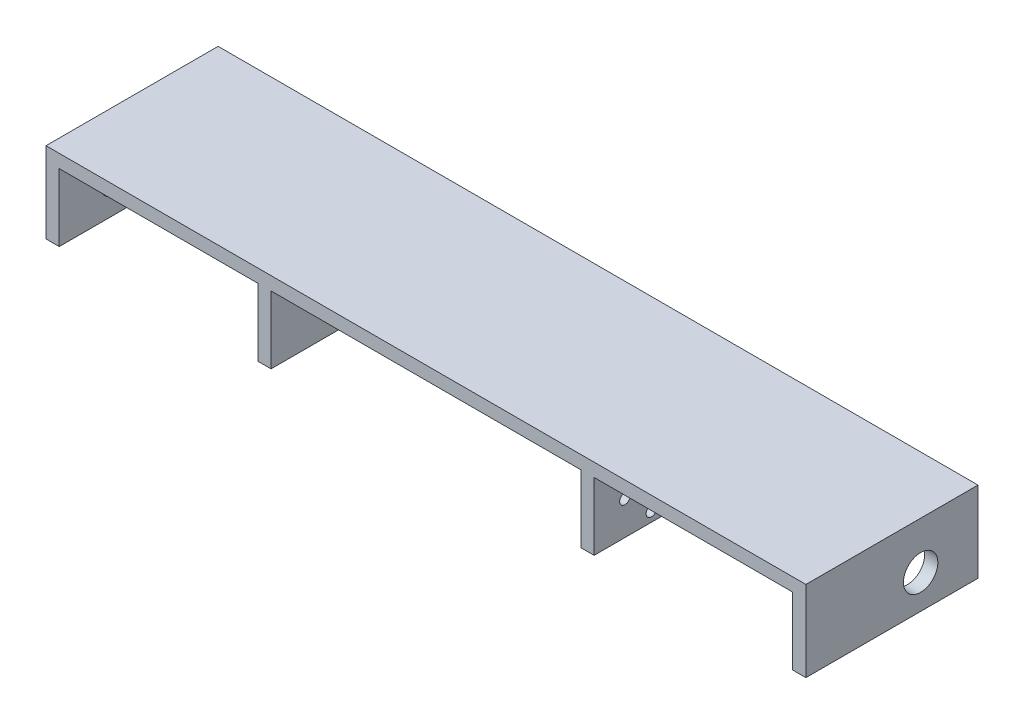
ISO-10303-21;
HEADER;
FILE_DESCRIPTION(('STEP AP214'),'2;1');
FILE_NAME('part.step','',(''),(''),'','','');
FILE_SCHEMA(('AUTOMOTIVE_DESIGN { 1 0 10303 214 1 1 1 1 }'));
ENDSEC;
DATA;
#1=APPLICATION_CONTEXT('core data for automotive mechanical design processes');
#2=APPLICATION_PROTOCOL_DEFINITION('international standard','automotive_design',2000,#1);
#3=PRODUCT_CONTEXT('',#1,'mechanical');
#4=PRODUCT('Part','Part','',(#3));
#5=PRODUCT_RELATED_PRODUCT_CATEGORY('part','',(#4));
#6=PRODUCT_DEFINITION_FORMATION('','',#4);
#7=PRODUCT_DEFINITION_CONTEXT('part definition',#1,'design');
#8=PRODUCT_DEFINITION('design','',#6,#7);
#9=PRODUCT_DEFINITION_SHAPE('','',#8);
#10=(LENGTH_UNIT() NAMED_UNIT(*) SI_UNIT(.MILLI.,.METRE.));
#11=(NAMED_UNIT(*) PLANE_ANGLE_UNIT() SI_UNIT($,.RADIAN.));
#12=(NAMED_UNIT(*) SI_UNIT($,.STERADIAN.) SOLID_ANGLE_UNIT());
#13=UNCERTAINTY_MEASURE_WITH_UNIT(LENGTH_MEASURE(1.E-05),#10,'distance_accuracy_value','');
#14=(GEOMETRIC_REPRESENTATION_CONTEXT(3) GLOBAL_UNCERTAINTY_ASSIGNED_CONTEXT((#13)) GLOBAL_UNIT_ASSIGNED_CONTEXT((#10,
#11,#12)) REPRESENTATION_CONTEXT('',''));
#15=CARTESIAN_POINT('',(0.,0.,0.));
#16=DIRECTION('',(0.,0.,1.));
#17=DIRECTION('',(1.,0.,0.));
#18=AXIS2_PLACEMENT_3D('',#15,#16,#17);
#19=CARTESIAN_POINT('',(0.,0.,0.));
#20=DIRECTION('',(0.,1.,0.));
#21=DIRECTION('',(0.,0.,1.));
#22=AXIS2_PLACEMENT_3D('',#19,#20,#21);
#23=PLANE('',#22);
#24=DIRECTION('',(1.,0.,0.));
#25=VECTOR('',#24,1.);
#26=CARTESIAN_POINT('',(158.32728197391,0.,-46.9681348074232));
#27=LINE('',#26,#25);
#28=CARTESIAN_POINT('',(158.32728197391,0.,-46.9681348074232));
#29=VERTEX_POINT('',#28);
#30=CARTESIAN_POINT('',(159.32728197391,0.,-46.9681348074232));
#31=VERTEX_POINT('',#30);
#32=EDGE_CURVE('E208',#29,#31,#27,.T.);
#33=ORIENTED_EDGE('',*,*,#32,.F.);
#34=DIRECTION('',(0.,0.,-1.));
#35=VECTOR('',#34,1.);
#36=CARTESIAN_POINT('',(158.32728197391,0.,-46.9681348074232));
#37=LINE('',#36,#35);
#38=CARTESIAN_POINT('',(158.32728197391,0.,-45.9681348074232));
#39=VERTEX_POINT('',#38);
#40=EDGE_CURVE('E215',#39,#29,#37,.T.);
#41=ORIENTED_EDGE('',*,*,#40,.F.);
#42=DIRECTION('',(1.,0.,0.));
#43=VECTOR('',#42,1.);
#44=CARTESIAN_POINT('',(158.32728197391,0.,-45.9681348074232));
#45=LINE('',#44,#43);
#46=CARTESIAN_POINT('',(159.32728197391,0.,-45.9681348074232));
#47=VERTEX_POINT('',#46);
#48=EDGE_CURVE('E216',#39,#47,#45,.T.);
#49=ORIENTED_EDGE('',*,*,#48,.T.);
#50=DIRECTION('',(0.,0.,-1.));
#51=VECTOR('',#50,1.);
#52=CARTESIAN_POINT('',(159.32728197391,0.,-74.2981348074232));
#53=LINE('',#52,#51);
#54=CARTESIAN_POINT('',(159.32728197391,0.,-15.9681348074232));
#55=VERTEX_POINT('',#54);
#56=EDGE_CURVE('E230',#55,#47,#53,.T.);
#57=ORIENTED_EDGE('',*,*,#56,.F.);
#58=DIRECTION('',(1.,0.,0.));
#59=VECTOR('',#58,1.);
#60=CARTESIAN_POINT('',(158.32728197391,0.,-15.9681348074232));
#61=LINE('',#60,#59);
#62=CARTESIAN_POINT('',(158.32728197391,0.,-15.9681348074232));
#63=VERTEX_POINT('',#62);
#64=EDGE_CURVE('E555',#63,#55,#61,.T.);
#65=ORIENTED_EDGE('',*,*,#64,.F.);
#66=DIRECTION('',(0.,0.,-1.));
#67=VECTOR('',#66,1.);
#68=CARTESIAN_POINT('',(158.32728197391,0.,-15.9681348074232));
#69=LINE('',#68,#67);
#70=CARTESIAN_POINT('',(158.32728197391,0.,-14.9681348074232));
#71=VERTEX_POINT('',#70);
#72=EDGE_CURVE('E553',#71,#63,#69,.T.);
#73=ORIENTED_EDGE('',*,*,#72,.F.);
#74=DIRECTION('',(1.,0.,0.));
#75=VECTOR('',#74,1.);
#76=CARTESIAN_POINT('',(158.32728197391,0.,-14.9681348074232));
#77=LINE('',#76,#75);
#78=CARTESIAN_POINT('',(159.32728197391,0.,-14.9681348074232));
#79=VERTEX_POINT('',#78);
#80=EDGE_CURVE('E559',#71,#79,#77,.T.);
#81=ORIENTED_EDGE('',*,*,#80,.T.);
#82=CARTESIAN_POINT('',(159.32728197391,0.,-9.29813480742324));
#83=VERTEX_POINT('',#82);
#84=EDGE_CURVE('E233',#83,#79,#53,.T.);
#85=ORIENTED_EDGE('',*,*,#84,.F.);
#86=DIRECTION('',(1.,0.,0.));
#87=VECTOR('',#86,1.);
#88=CARTESIAN_POINT('',(-42.6727180260896,0.,-9.29813480742324));
#89=LINE('',#88,#87);
#90=CARTESIAN_POINT('',(42.3272819739104,0.,-9.29813480742324));
#91=VERTEX_POINT('',#90);
#92=EDGE_CURVE('E349',#91,#83,#89,.T.);
#93=ORIENTED_EDGE('',*,*,#92,.F.);
#94=DIRECTION('',(0.,0.,-1.));
#95=VECTOR('',#94,1.);
#96=CARTESIAN_POINT('',(42.3272819739104,0.,-9.29813480742324));
#97=LINE('',#96,#95);
#98=CARTESIAN_POINT('',(42.3272819739104,0.,-74.2981348074232));
#99=VERTEX_POINT('',#98);
#100=EDGE_CURVE('E294',#91,#99,#97,.T.);
#101=ORIENTED_EDGE('',*,*,#100,.T.);
#102=DIRECTION('',(-1.,0.,0.));
#103=VECTOR('',#102,1.);
#104=CARTESIAN_POINT('',(-42.6727180260896,0.,-74.2981348074232));
#105=LINE('',#104,#103);
#106=CARTESIAN_POINT('',(159.32728197391,0.,-74.2981348074232));
#107=VERTEX_POINT('',#106);
#108=EDGE_CURVE('E229',#107,#99,#105,.T.);
#109=ORIENTED_EDGE('',*,*,#108,.F.);
#110=EDGE_CURVE('E222',#31,#107,#53,.T.);
#111=ORIENTED_EDGE('',*,*,#110,.F.);
#112=EDGE_LOOP('',(#33,#41,#49,#57,#65,#73,#81,#85,#93,#101,#109,#111));
#113=FACE_BOUND('',#112,.T.);
#114=ADVANCED_FACE('F47',(#113),#23,.F.);
#115=CARTESIAN_POINT('',(159.32728197391,-25.5,-74.2981348074232));
#116=DIRECTION('',(1.,0.,0.));
#117=DIRECTION('',(0.,0.,-1.));
#118=AXIS2_PLACEMENT_3D('',#115,#116,#117);
#119=PLANE('',#118);
#120=CARTESIAN_POINT('',(159.32728197391,-12.75,-52.6314681407566));
#121=DIRECTION('',(1.,0.,0.));
#122=DIRECTION('',(0.,0.,-1.));
#123=AXIS2_PLACEMENT_3D('',#120,#121,#122);
#124=CIRCLE('',#123,4.5);
#125=CARTESIAN_POINT('',(159.32728197391,-12.75,-57.1314681407566));
#126=VERTEX_POINT('',#125);
#127=EDGE_CURVE('E572',#126,#126,#124,.F.);
#128=ORIENTED_EDGE('',*,*,#127,.F.);
#129=EDGE_LOOP('',(#128));
#130=FACE_BOUND('',#129,.T.);
#131=DIRECTION('',(0.,-1.,0.));
#132=VECTOR('',#131,1.);
#133=CARTESIAN_POINT('',(159.32728197391,-25.5,-46.9681348074232));
#134=LINE('',#133,#132);
#135=CARTESIAN_POINT('',(159.32728197391,-25.5,-46.9681348074232));
#136=VERTEX_POINT('',#135);
#137=EDGE_CURVE('E62',#31,#136,#134,.T.);
#138=ORIENTED_EDGE('',*,*,#137,.F.);
#139=ORIENTED_EDGE('',*,*,#110,.T.);
#140=DIRECTION('',(0.,1.,0.));
#141=VECTOR('',#140,1.);
#142=CARTESIAN_POINT('',(159.32728197391,-25.5,-74.2981348074232));
#143=LINE('',#142,#141);
#144=CARTESIAN_POINT('',(159.32728197391,-25.5,-74.2981348074232));
#145=VERTEX_POINT('',#144);
#146=EDGE_CURVE('E262',#145,#107,#143,.T.);
#147=ORIENTED_EDGE('',*,*,#146,.F.);
#148=DIRECTION('',(0.,0.,-1.));
#149=VECTOR('',#148,1.);
#150=CARTESIAN_POINT('',(159.32728197391,-25.5,-74.2981348074232));
#151=LINE('',#150,#149);
#152=EDGE_CURVE('E224',#136,#145,#151,.T.);
#153=ORIENTED_EDGE('',*,*,#152,.F.);
#154=EDGE_LOOP('',(#138,#139,#147,#153));
#155=FACE_BOUND('',#154,.T.);
#156=ADVANCED_FACE('F220',(#130,#155),#119,.F.);
#157=CARTESIAN_POINT('',(159.32728197391,-12.75,-20.9681348074232));
#158=DIRECTION('',(-1.,0.,0.));
#159=DIRECTION('',(0.,0.,1.));
#160=AXIS2_PLACEMENT_3D('',#157,#158,#159);
#161=CIRCLE('',#160,2.);
#162=CARTESIAN_POINT('',(159.32728197391,-12.75,-18.9681348074232));
#163=VERTEX_POINT('',#162);
#164=EDGE_CURVE('E508',#163,#163,#161,.T.);
#165=ORIENTED_EDGE('',*,*,#164,.F.);
#166=EDGE_LOOP('',(#165));
#167=FACE_BOUND('',#166,.T.);
#168=CARTESIAN_POINT('',(159.32728197391,-12.75,-40.9681348074232));
#169=DIRECTION('',(-1.,0.,0.));
#170=DIRECTION('',(0.,0.,1.));
#171=AXIS2_PLACEMENT_3D('',#168,#169,#170);
#172=CIRCLE('',#171,2.);
#173=CARTESIAN_POINT('',(159.32728197391,-12.75,-38.9681348074232));
#174=VERTEX_POINT('',#173);
#175=EDGE_CURVE('E516',#174,#174,#172,.T.);
#176=ORIENTED_EDGE('',*,*,#175,.F.);
#177=EDGE_LOOP('',(#176));
#178=FACE_BOUND('',#177,.T.);
#179=CARTESIAN_POINT('',(159.32728197391,-21.75,-30.9681348074232));
#180=DIRECTION('',(-1.,0.,0.));
#181=DIRECTION('',(0.,0.,1.));
#182=AXIS2_PLACEMENT_3D('',#179,#180,#181);
#183=CIRCLE('',#182,2.);
#184=CARTESIAN_POINT('',(159.32728197391,-21.75,-28.9681348074232));
#185=VERTEX_POINT('',#184);
#186=EDGE_CURVE('E522',#185,#185,#183,.T.);
#187=ORIENTED_EDGE('',*,*,#186,.F.);
#188=EDGE_LOOP('',(#187));
#189=FACE_BOUND('',#188,.T.);
#190=CARTESIAN_POINT('',(159.32728197391,-3.75,-30.9681348074232));
#191=DIRECTION('',(-1.,0.,0.));
#192=DIRECTION('',(0.,0.,1.));
#193=AXIS2_PLACEMENT_3D('',#190,#191,#192);
#194=CIRCLE('',#193,2.);
#195=CARTESIAN_POINT('',(159.32728197391,-3.75,-28.9681348074232));
#196=VERTEX_POINT('',#195);
#197=EDGE_CURVE('E528',#196,#196,#194,.T.);
#198=ORIENTED_EDGE('',*,*,#197,.F.);
#199=EDGE_LOOP('',(#198));
#200=FACE_BOUND('',#199,.T.);
#201=DIRECTION('',(0.,1.,0.));
#202=VECTOR('',#201,1.);
#203=CARTESIAN_POINT('',(159.32728197391,-25.5,-45.9681348074232));
#204=LINE('',#203,#202);
#205=CARTESIAN_POINT('',(159.32728197391,-25.5,-45.9681348074232));
#206=VERTEX_POINT('',#205);
#207=EDGE_CURVE('E225',#206,#47,#204,.T.);
#208=ORIENTED_EDGE('',*,*,#207,.F.);
#209=CARTESIAN_POINT('',(159.32728197391,-25.5,-15.9681348074232));
#210=VERTEX_POINT('',#209);
#211=EDGE_CURVE('E258',#210,#206,#151,.T.);
#212=ORIENTED_EDGE('',*,*,#211,.F.);
#213=DIRECTION('',(0.,-1.,0.));
#214=VECTOR('',#213,1.);
#215=CARTESIAN_POINT('',(159.32728197391,-25.5,-15.9681348074232));
#216=LINE('',#215,#214);
#217=EDGE_CURVE('E70',#55,#210,#216,.T.);
#218=ORIENTED_EDGE('',*,*,#217,.F.);
#219=ORIENTED_EDGE('',*,*,#56,.T.);
#220=EDGE_LOOP('',(#208,#212,#218,#219));
#221=FACE_BOUND('',#220,.T.);
#222=ADVANCED_FACE('F439',(#167,#178,#189,#200,#221),#119,.F.);
#223=DIRECTION('',(0.,1.,0.));
#224=VECTOR('',#223,1.);
#225=CARTESIAN_POINT('',(159.32728197391,-25.5,-14.9681348074232));
#226=LINE('',#225,#224);
#227=CARTESIAN_POINT('',(159.32728197391,-25.5,-14.9681348074232));
#228=VERTEX_POINT('',#227);
#229=EDGE_CURVE('E549',#228,#79,#226,.T.);
#230=ORIENTED_EDGE('',*,*,#229,.F.);
#231=CARTESIAN_POINT('',(159.32728197391,-25.5,-9.29813480742324));
#232=VERTEX_POINT('',#231);
#233=EDGE_CURVE('E254',#232,#228,#151,.T.);
#234=ORIENTED_EDGE('',*,*,#233,.F.);
#235=DIRECTION('',(0.,1.,0.));
#236=VECTOR('',#235,1.);
#237=CARTESIAN_POINT('',(159.32728197391,-25.5,-9.29813480742324));
#238=LINE('',#237,#236);
#239=EDGE_CURVE('E265',#232,#83,#238,.T.);
#240=ORIENTED_EDGE('',*,*,#239,.T.);
#241=ORIENTED_EDGE('',*,*,#84,.T.);
#242=EDGE_LOOP('',(#230,#234,#240,#241));
#243=FACE_BOUND('',#242,.T.);
#244=ADVANCED_FACE('F441',(#243),#119,.F.);
#245=DIRECTION('',(0.,0.,1.));
#246=VECTOR('',#245,1.);
#247=CARTESIAN_POINT('',(164.32728197391,0.,-74.2981348074232));
#248=LINE('',#247,#246);
#249=CARTESIAN_POINT('',(164.32728197391,0.,-74.2981348074232));
#250=VERTEX_POINT('',#249);
#251=CARTESIAN_POINT('',(164.32728197391,0.,-9.29813480742324));
#252=VERTEX_POINT('',#251);
#253=EDGE_CURVE('E231',#250,#252,#248,.T.);
#254=ORIENTED_EDGE('',*,*,#253,.F.);
#255=CARTESIAN_POINT('',(239.32728197391,0.,-74.2981348074232));
#256=VERTEX_POINT('',#255);
#257=EDGE_CURVE('E338',#256,#250,#105,.T.);
#258=ORIENTED_EDGE('',*,*,#257,.F.);
#259=DIRECTION('',(0.,0.,-1.));
#260=VECTOR('',#259,1.);
#261=CARTESIAN_POINT('',(239.32728197391,0.,-9.29813480742324));
#262=LINE('',#261,#260);
#263=CARTESIAN_POINT('',(239.32728197391,0.,-9.29813480742324));
#264=VERTEX_POINT('',#263);
#265=EDGE_CURVE('E271',#264,#256,#262,.T.);
#266=ORIENTED_EDGE('',*,*,#265,.F.);
#267=EDGE_CURVE('E333',#252,#264,#89,.T.);
#268=ORIENTED_EDGE('',*,*,#267,.F.);
#269=EDGE_LOOP('',(#254,#258,#266,#268));
#270=FACE_BOUND('',#269,.T.);
#271=ADVANCED_FACE('F415',(#270),#23,.F.);
#272=DIRECTION('',(0.,0.,-1.));
#273=VECTOR('',#272,1.);
#274=CARTESIAN_POINT('',(37.3272819739104,0.,-9.29813480742324));
#275=LINE('',#274,#273);
#276=CARTESIAN_POINT('',(37.3272819739104,0.,-9.29813480742324));
#277=VERTEX_POINT('',#276);
#278=CARTESIAN_POINT('',(37.3272819739104,0.,-74.2981348074232));
#279=VERTEX_POINT('',#278);
#280=EDGE_CURVE('E289',#277,#279,#275,.T.);
#281=ORIENTED_EDGE('',*,*,#280,.F.);
#282=CARTESIAN_POINT('',(-37.6727180260896,0.,-9.29813480742324));
#283=VERTEX_POINT('',#282);
#284=EDGE_CURVE('E345',#283,#277,#89,.T.);
#285=ORIENTED_EDGE('',*,*,#284,.F.);
#286=DIRECTION('',(0.,0.,1.));
#287=VECTOR('',#286,1.);
#288=CARTESIAN_POINT('',(-37.6727180260896,0.,-74.2981348074232));
#289=LINE('',#288,#287);
#290=CARTESIAN_POINT('',(-37.6727180260896,0.,-74.2981348074232));
#291=VERTEX_POINT('',#290);
#292=EDGE_CURVE('E314',#291,#283,#289,.T.);
#293=ORIENTED_EDGE('',*,*,#292,.F.);
#294=EDGE_CURVE('E348',#279,#291,#105,.T.);
#295=ORIENTED_EDGE('',*,*,#294,.F.);
#296=EDGE_LOOP('',(#281,#285,#293,#295));
#297=FACE_BOUND('',#296,.T.);
#298=ADVANCED_FACE('F394',(#297),#23,.F.);
#299=CARTESIAN_POINT('',(-42.6727180260896,5.,-74.2981348074232));
#300=DIRECTION('',(1.,0.,0.));
#301=DIRECTION('',(0.,0.,-1.));
#302=AXIS2_PLACEMENT_3D('',#299,#300,#301);
#303=PLANE('',#302);
#304=CARTESIAN_POINT('',(-42.6727180260896,-12.75,-30.9648014740899));
#305=DIRECTION('',(-1.,0.,0.));
#306=DIRECTION('',(0.,0.,1.));
#307=AXIS2_PLACEMENT_3D('',#304,#305,#306);
#308=CIRCLE('',#307,6.5);
#309=CARTESIAN_POINT('',(-42.6727180260896,-12.75,-24.4648014740899));
#310=VERTEX_POINT('',#309);
#311=EDGE_CURVE('E583',#310,#310,#308,.T.);
#312=ORIENTED_EDGE('',*,*,#311,.F.);
#313=EDGE_LOOP('',(#312));
#314=FACE_BOUND('',#313,.T.);
#315=DIRECTION('',(0.,-1.,0.));
#316=VECTOR('',#315,1.);
#317=CARTESIAN_POINT('',(-42.6727180260896,5.,-74.2981348074232));
#318=LINE('',#317,#316);
#319=CARTESIAN_POINT('',(-42.6727180260896,5.,-74.2981348074232));
#320=VERTEX_POINT('',#319);
#321=CARTESIAN_POINT('',(-42.6727180260896,-25.5,-74.2981348074232));
#322=VERTEX_POINT('',#321);
#323=EDGE_CURVE('E344',#320,#322,#318,.T.);
#324=ORIENTED_EDGE('',*,*,#323,.T.);
#325=DIRECTION('',(0.,0.,-1.));
#326=VECTOR('',#325,1.);
#327=CARTESIAN_POINT('',(-42.6727180260896,-25.5,-74.2981348074232));
#328=LINE('',#327,#326);
#329=CARTESIAN_POINT('',(-42.6727180260896,-25.5,-9.29813480742324));
#330=VERTEX_POINT('',#329);
#331=EDGE_CURVE('E315',#330,#322,#328,.T.);
#332=ORIENTED_EDGE('',*,*,#331,.F.);
#333=DIRECTION('',(0.,-1.,0.));
#334=VECTOR('',#333,1.);
#335=CARTESIAN_POINT('',(-42.6727180260896,5.,-9.29813480742324));
#336=LINE('',#335,#334);
#337=CARTESIAN_POINT('',(-42.6727180260896,5.,-9.29813480742324));
#338=VERTEX_POINT('',#337);
#339=EDGE_CURVE('E11',#338,#330,#336,.T.);
#340=ORIENTED_EDGE('',*,*,#339,.F.);
#341=DIRECTION('',(0.,0.,1.));
#342=VECTOR('',#341,1.);
#343=CARTESIAN_POINT('',(-42.6727180260896,5.,-74.2981348074232));
#344=LINE('',#343,#342);
#345=EDGE_CURVE('E334',#320,#338,#344,.T.);
#346=ORIENTED_EDGE('',*,*,#345,.F.);
#347=EDGE_LOOP('',(#324,#332,#340,#346));
#348=FACE_BOUND('',#347,.T.);
#349=ADVANCED_FACE('F49',(#314,#348),#303,.F.);
#350=CARTESIAN_POINT('',(-42.6727180260896,5.,-9.29813480742324));
#351=DIRECTION('',(0.,0.,-1.));
#352=DIRECTION('',(-1.,0.,0.));
#353=AXIS2_PLACEMENT_3D('',#350,#351,#352);
#354=PLANE('',#353);
#355=ORIENTED_EDGE('',*,*,#339,.T.);
#356=DIRECTION('',(-1.,0.,0.));
#357=VECTOR('',#356,1.);
#358=CARTESIAN_POINT('',(-42.6727180260896,-25.5,-9.29813480742324));
#359=LINE('',#358,#357);
#360=CARTESIAN_POINT('',(-37.6727180260896,-25.5,-9.29813480742324));
#361=VERTEX_POINT('',#360);
#362=EDGE_CURVE('E322',#361,#330,#359,.T.);
#363=ORIENTED_EDGE('',*,*,#362,.F.);
#364=DIRECTION('',(0.,1.,0.));
#365=VECTOR('',#364,1.);
#366=CARTESIAN_POINT('',(-37.6727180260896,-25.5,-9.29813480742324));
#367=LINE('',#366,#365);
#368=EDGE_CURVE('E325',#361,#283,#367,.T.);
#369=ORIENTED_EDGE('',*,*,#368,.T.);
#370=ORIENTED_EDGE('',*,*,#284,.T.);
#371=DIRECTION('',(0.,1.,0.));
#372=VECTOR('',#371,1.);
#373=CARTESIAN_POINT('',(37.3272819739104,-25.5,-9.29813480742324));
#374=LINE('',#373,#372);
#375=CARTESIAN_POINT('',(37.3272819739104,-25.5,-9.29813480742324));
#376=VERTEX_POINT('',#375);
#377=EDGE_CURVE('E312',#376,#277,#374,.T.);
#378=ORIENTED_EDGE('',*,*,#377,.F.);
#379=DIRECTION('',(-1.,0.,0.));
#380=VECTOR('',#379,1.);
#381=CARTESIAN_POINT('',(42.3272819739104,-25.5,-9.29813480742324));
#382=LINE('',#381,#380);
#383=CARTESIAN_POINT('',(42.3272819739104,-25.5,-9.29813480742324));
#384=VERTEX_POINT('',#383);
#385=EDGE_CURVE('E290',#384,#376,#382,.T.);
#386=ORIENTED_EDGE('',*,*,#385,.F.);
#387=DIRECTION('',(0.,1.,0.));
#388=VECTOR('',#387,1.);
#389=CARTESIAN_POINT('',(42.3272819739104,-25.5,-9.29813480742324));
#390=LINE('',#389,#388);
#391=EDGE_CURVE('E302',#384,#91,#390,.T.);
#392=ORIENTED_EDGE('',*,*,#391,.T.);
#393=ORIENTED_EDGE('',*,*,#92,.T.);
#394=ORIENTED_EDGE('',*,*,#239,.F.);
#395=DIRECTION('',(-1.,0.,0.));
#396=VECTOR('',#395,1.);
#397=CARTESIAN_POINT('',(164.32728197391,-25.5,-9.29813480742324));
#398=LINE('',#397,#396);
#399=CARTESIAN_POINT('',(164.32728197391,-25.5,-9.29813480742324));
#400=VERTEX_POINT('',#399);
#401=EDGE_CURVE('E245',#400,#232,#398,.T.);
#402=ORIENTED_EDGE('',*,*,#401,.F.);
#403=DIRECTION('',(0.,1.,0.));
#404=VECTOR('',#403,1.);
#405=CARTESIAN_POINT('',(164.32728197391,-25.5,-9.29813480742324));
#406=LINE('',#405,#404);
#407=EDGE_CURVE('E269',#400,#252,#406,.T.);
#408=ORIENTED_EDGE('',*,*,#407,.T.);
#409=ORIENTED_EDGE('',*,*,#267,.T.);
#410=DIRECTION('',(0.,1.,0.));
#411=VECTOR('',#410,1.);
#412=CARTESIAN_POINT('',(239.32728197391,-25.5,-9.29813480742324));
#413=LINE('',#412,#411);
#414=CARTESIAN_POINT('',(239.32728197391,-25.5,-9.29813480742324));
#415=VERTEX_POINT('',#414);
#416=EDGE_CURVE('E286',#415,#264,#413,.T.);
#417=ORIENTED_EDGE('',*,*,#416,.F.);
#418=DIRECTION('',(-1.,0.,0.));
#419=VECTOR('',#418,1.);
#420=CARTESIAN_POINT('',(244.32728197391,-25.5,-9.29813480742324));
#421=LINE('',#420,#419);
#422=CARTESIAN_POINT('',(244.32728197391,-25.5,-9.29813480742324));
#423=VERTEX_POINT('',#422);
#424=EDGE_CURVE('E275',#423,#415,#421,.T.);
#425=ORIENTED_EDGE('',*,*,#424,.F.);
#426=DIRECTION('',(0.,-1.,0.));
#427=VECTOR('',#426,1.);
#428=CARTESIAN_POINT('',(244.32728197391,5.,-9.29813480742324));
#429=LINE('',#428,#427);
#430=CARTESIAN_POINT('',(244.32728197391,5.,-9.29813480742324));
#431=VERTEX_POINT('',#430);
#432=EDGE_CURVE('E55',#431,#423,#429,.T.);
#433=ORIENTED_EDGE('',*,*,#432,.F.);
#434=DIRECTION('',(1.,0.,0.));
#435=VECTOR('',#434,1.);
#436=CARTESIAN_POINT('',(-42.6727180260896,5.,-9.29813480742324));
#437=LINE('',#436,#435);
#438=EDGE_CURVE('E337',#338,#431,#437,.T.);
#439=ORIENTED_EDGE('',*,*,#438,.F.);
#440=EDGE_LOOP('',(#355,#363,#369,#370,#378,#386,#392,#393,#394,#402,#408,#409,#417,#425,#433,#439));
#441=FACE_BOUND('',#440,.T.);
#442=ADVANCED_FACE('F363',(#441),#354,.F.);
#443=CARTESIAN_POINT('',(244.32728197391,5.,-74.2981348074232));
#444=DIRECTION('',(-1.,0.,0.));
#445=DIRECTION('',(0.,0.,1.));
#446=AXIS2_PLACEMENT_3D('',#443,#444,#445);
#447=PLANE('',#446);
#448=CARTESIAN_POINT('',(244.32728197391,-12.75,-52.6314681407566));
#449=DIRECTION('',(1.,0.,0.));
#450=DIRECTION('',(0.,0.,-1.));
#451=AXIS2_PLACEMENT_3D('',#448,#449,#450);
#452=CIRCLE('',#451,6.5);
#453=CARTESIAN_POINT('',(244.32728197391,-12.75,-59.1314681407566));
#454=VERTEX_POINT('',#453);
#455=EDGE_CURVE('E581',#454,#454,#452,.T.);
#456=ORIENTED_EDGE('',*,*,#455,.F.);
#457=EDGE_LOOP('',(#456));
#458=FACE_BOUND('',#457,.T.);
#459=ORIENTED_EDGE('',*,*,#432,.T.);
#460=DIRECTION('',(0.,0.,1.));
#461=VECTOR('',#460,1.);
#462=CARTESIAN_POINT('',(244.32728197391,-25.5,-9.29813480742324));
#463=LINE('',#462,#461);
#464=CARTESIAN_POINT('',(244.32728197391,-25.5,-74.2981348074232));
#465=VERTEX_POINT('',#464);
#466=EDGE_CURVE('E272',#465,#423,#463,.T.);
#467=ORIENTED_EDGE('',*,*,#466,.F.);
#468=DIRECTION('',(0.,-1.,0.));
#469=VECTOR('',#468,1.);
#470=CARTESIAN_POINT('',(244.32728197391,5.,-74.2981348074232));
#471=LINE('',#470,#469);
#472=CARTESIAN_POINT('',(244.32728197391,5.,-74.2981348074232));
#473=VERTEX_POINT('',#472);
#474=EDGE_CURVE('E353',#473,#465,#471,.T.);
#475=ORIENTED_EDGE('',*,*,#474,.F.);
#476=DIRECTION('',(0.,0.,-1.));
#477=VECTOR('',#476,1.);
#478=CARTESIAN_POINT('',(244.32728197391,5.,-74.2981348074232));
#479=LINE('',#478,#477);
#480=EDGE_CURVE('E340',#431,#473,#479,.T.);
#481=ORIENTED_EDGE('',*,*,#480,.F.);
#482=EDGE_LOOP('',(#459,#467,#475,#481));
#483=FACE_BOUND('',#482,.T.);
#484=ADVANCED_FACE('F359',(#458,#483),#447,.F.);
#485=CARTESIAN_POINT('',(-42.6727180260896,5.,-74.2981348074232));
#486=DIRECTION('',(0.,0.,1.));
#487=DIRECTION('',(1.,0.,0.));
#488=AXIS2_PLACEMENT_3D('',#485,#486,#487);
#489=PLANE('',#488);
#490=ORIENTED_EDGE('',*,*,#474,.T.);
#491=DIRECTION('',(1.,0.,0.));
#492=VECTOR('',#491,1.);
#493=CARTESIAN_POINT('',(244.32728197391,-25.5,-74.2981348074232));
#494=LINE('',#493,#492);
#495=CARTESIAN_POINT('',(239.32728197391,-25.5,-74.2981348074232));
#496=VERTEX_POINT('',#495);
#497=EDGE_CURVE('E279',#496,#465,#494,.T.);
#498=ORIENTED_EDGE('',*,*,#497,.F.);
#499=DIRECTION('',(0.,1.,0.));
#500=VECTOR('',#499,1.);
#501=CARTESIAN_POINT('',(239.32728197391,-25.5,-74.2981348074232));
#502=LINE('',#501,#500);
#503=EDGE_CURVE('E282',#496,#256,#502,.T.);
#504=ORIENTED_EDGE('',*,*,#503,.T.);
#505=ORIENTED_EDGE('',*,*,#257,.T.);
#506=DIRECTION('',(0.,1.,0.));
#507=VECTOR('',#506,1.);
#508=CARTESIAN_POINT('',(164.32728197391,-25.5,-74.2981348074232));
#509=LINE('',#508,#507);
#510=CARTESIAN_POINT('',(164.32728197391,-25.5,-74.2981348074232));
#511=VERTEX_POINT('',#510);
#512=EDGE_CURVE('E259',#511,#250,#509,.T.);
#513=ORIENTED_EDGE('',*,*,#512,.F.);
#514=DIRECTION('',(1.,0.,0.));
#515=VECTOR('',#514,1.);
#516=CARTESIAN_POINT('',(164.32728197391,-25.5,-74.2981348074232));
#517=LINE('',#516,#515);
#518=EDGE_CURVE('E257',#145,#511,#517,.T.);
#519=ORIENTED_EDGE('',*,*,#518,.F.);
#520=ORIENTED_EDGE('',*,*,#146,.T.);
#521=ORIENTED_EDGE('',*,*,#108,.T.);
#522=DIRECTION('',(0.,1.,0.));
#523=VECTOR('',#522,1.);
#524=CARTESIAN_POINT('',(42.3272819739104,-25.5,-74.2981348074232));
#525=LINE('',#524,#523);
#526=CARTESIAN_POINT('',(42.3272819739104,-25.5,-74.2981348074232));
#527=VERTEX_POINT('',#526);
#528=EDGE_CURVE('E306',#527,#99,#525,.T.);
#529=ORIENTED_EDGE('',*,*,#528,.F.);
#530=DIRECTION('',(-1.,0.,0.));
#531=VECTOR('',#530,1.);
#532=CARTESIAN_POINT('',(42.3272819739104,-25.5,-74.2981348074232));
#533=LINE('',#532,#531);
#534=CARTESIAN_POINT('',(37.3272819739104,-25.5,-74.2981348074232));
#535=VERTEX_POINT('',#534);
#536=EDGE_CURVE('E296',#527,#535,#533,.T.);
#537=ORIENTED_EDGE('',*,*,#536,.T.);
#538=DIRECTION('',(0.,1.,0.));
#539=VECTOR('',#538,1.);
#540=CARTESIAN_POINT('',(37.3272819739104,-25.5,-74.2981348074232));
#541=LINE('',#540,#539);
#542=EDGE_CURVE('E309',#535,#279,#541,.T.);
#543=ORIENTED_EDGE('',*,*,#542,.T.);
#544=ORIENTED_EDGE('',*,*,#294,.T.);
#545=DIRECTION('',(0.,1.,0.));
#546=VECTOR('',#545,1.);
#547=CARTESIAN_POINT('',(-37.6727180260896,-25.5,-74.2981348074232));
#548=LINE('',#547,#546);
#549=CARTESIAN_POINT('',(-37.6727180260896,-25.5,-74.2981348074232));
#550=VERTEX_POINT('',#549);
#551=EDGE_CURVE('E330',#550,#291,#548,.T.);
#552=ORIENTED_EDGE('',*,*,#551,.F.);
#553=DIRECTION('',(1.,0.,0.));
#554=VECTOR('',#553,1.);
#555=CARTESIAN_POINT('',(-42.6727180260896,-25.5,-74.2981348074232));
#556=LINE('',#555,#554);
#557=EDGE_CURVE('E318',#322,#550,#556,.T.);
#558=ORIENTED_EDGE('',*,*,#557,.F.);
#559=ORIENTED_EDGE('',*,*,#323,.F.);
#560=DIRECTION('',(-1.,0.,0.));
#561=VECTOR('',#560,1.);
#562=CARTESIAN_POINT('',(-42.6727180260896,5.,-74.2981348074232));
#563=LINE('',#562,#561);
#564=EDGE_CURVE('E342',#473,#320,#563,.T.);
#565=ORIENTED_EDGE('',*,*,#564,.F.);
#566=EDGE_LOOP('',(#490,#498,#504,#505,#513,#519,#520,#521,#529,#537,#543,#544,#552,#558,#559,#565));
#567=FACE_BOUND('',#566,.T.);
#568=ADVANCED_FACE('F370',(#567),#489,.F.);
#569=CARTESIAN_POINT('',(0.,5.,0.));
#570=DIRECTION('',(0.,1.,0.));
#571=DIRECTION('',(0.,0.,1.));
#572=AXIS2_PLACEMENT_3D('',#569,#570,#571);
#573=PLANE('',#572);
#574=ORIENTED_EDGE('',*,*,#345,.T.);
#575=ORIENTED_EDGE('',*,*,#438,.T.);
#576=ORIENTED_EDGE('',*,*,#480,.T.);
#577=ORIENTED_EDGE('',*,*,#564,.T.);
#578=EDGE_LOOP('',(#574,#575,#576,#577));
#579=FACE_BOUND('',#578,.T.);
#580=ADVANCED_FACE('F376',(#579),#573,.T.);
#581=CARTESIAN_POINT('',(-37.6727180260896,-25.5,-74.2981348074232));
#582=DIRECTION('',(-1.,0.,0.));
#583=DIRECTION('',(0.,0.,1.));
#584=AXIS2_PLACEMENT_3D('',#581,#582,#583);
#585=PLANE('',#584);
#586=CARTESIAN_POINT('',(-37.6727180260896,-12.75,-30.9648014740899));
#587=DIRECTION('',(-1.,0.,0.));
#588=DIRECTION('',(0.,0.,1.));
#589=AXIS2_PLACEMENT_3D('',#586,#587,#588);
#590=CIRCLE('',#589,6.5);
#591=CARTESIAN_POINT('',(-37.6727180260896,-12.75,-24.4648014740899));
#592=VERTEX_POINT('',#591);
#593=EDGE_CURVE('E236',#592,#592,#590,.F.);
#594=ORIENTED_EDGE('',*,*,#593,.F.);
#595=EDGE_LOOP('',(#594));
#596=FACE_BOUND('',#595,.T.);
#597=ORIENTED_EDGE('',*,*,#292,.T.);
#598=ORIENTED_EDGE('',*,*,#368,.F.);
#599=DIRECTION('',(0.,0.,1.));
#600=VECTOR('',#599,1.);
#601=CARTESIAN_POINT('',(-37.6727180260896,-25.5,-74.2981348074232));
#602=LINE('',#601,#600);
#603=EDGE_CURVE('E320',#550,#361,#602,.T.);
#604=ORIENTED_EDGE('',*,*,#603,.F.);
#605=ORIENTED_EDGE('',*,*,#551,.T.);
#606=EDGE_LOOP('',(#597,#598,#604,#605));
#607=FACE_BOUND('',#606,.T.);
#608=ADVANCED_FACE('F389',(#596,#607),#585,.F.);
#609=CARTESIAN_POINT('',(0.,-25.5,0.));
#610=DIRECTION('',(0.,1.,0.));
#611=DIRECTION('',(0.,0.,1.));
#612=AXIS2_PLACEMENT_3D('',#609,#610,#611);
#613=PLANE('',#612);
#614=ORIENTED_EDGE('',*,*,#331,.T.);
#615=ORIENTED_EDGE('',*,*,#557,.T.);
#616=ORIENTED_EDGE('',*,*,#603,.T.);
#617=ORIENTED_EDGE('',*,*,#362,.T.);
#618=EDGE_LOOP('',(#614,#615,#616,#617));
#619=FACE_BOUND('',#618,.T.);
#620=ADVANCED_FACE('F382',(#619),#613,.F.);
#621=CARTESIAN_POINT('',(37.3272819739104,-25.5,-9.29813480742324));
#622=DIRECTION('',(1.,0.,0.));
#623=DIRECTION('',(0.,0.,-1.));
#624=AXIS2_PLACEMENT_3D('',#621,#622,#623);
#625=PLANE('',#624);
#626=CARTESIAN_POINT('',(37.3272819739104,-12.75,-30.9648014740899));
#627=DIRECTION('',(-1.,0.,0.));
#628=DIRECTION('',(0.,0.,1.));
#629=AXIS2_PLACEMENT_3D('',#626,#627,#628);
#630=CIRCLE('',#629,4.5);
#631=CARTESIAN_POINT('',(37.3272819739104,-12.75,-26.4648014740899));
#632=VERTEX_POINT('',#631);
#633=EDGE_CURVE('E569',#632,#632,#630,.T.);
#634=ORIENTED_EDGE('',*,*,#633,.F.);
#635=EDGE_LOOP('',(#634));
#636=FACE_BOUND('',#635,.T.);
#637=ORIENTED_EDGE('',*,*,#280,.T.);
#638=ORIENTED_EDGE('',*,*,#542,.F.);
#639=DIRECTION('',(0.,0.,-1.));
#640=VECTOR('',#639,1.);
#641=CARTESIAN_POINT('',(37.3272819739104,-25.5,-9.29813480742324));
#642=LINE('',#641,#640);
#643=EDGE_CURVE('E293',#376,#535,#642,.T.);
#644=ORIENTED_EDGE('',*,*,#643,.F.);
#645=ORIENTED_EDGE('',*,*,#377,.T.);
#646=EDGE_LOOP('',(#637,#638,#644,#645));
#647=FACE_BOUND('',#646,.T.);
#648=ADVANCED_FACE('F397',(#636,#647),#625,.F.);
#649=CARTESIAN_POINT('',(42.3272819739104,-25.5,-9.29813480742324));
#650=DIRECTION('',(1.,0.,0.));
#651=DIRECTION('',(0.,0.,-1.));
#652=AXIS2_PLACEMENT_3D('',#649,#650,#651);
#653=PLANE('',#652);
#654=CARTESIAN_POINT('',(42.3272819739104,-12.75,-30.9648014740899));
#655=DIRECTION('',(1.,0.,0.));
#656=DIRECTION('',(0.,0.,-1.));
#657=AXIS2_PLACEMENT_3D('',#654,#655,#656);
#658=CIRCLE('',#657,4.5);
#659=CARTESIAN_POINT('',(42.3272819739104,-12.75,-35.4648014740899));
#660=VERTEX_POINT('',#659);
#661=EDGE_CURVE('E566',#660,#660,#658,.F.);
#662=ORIENTED_EDGE('',*,*,#661,.T.);
#663=EDGE_LOOP('',(#662));
#664=FACE_BOUND('',#663,.T.);
#665=ORIENTED_EDGE('',*,*,#100,.F.);
#666=ORIENTED_EDGE('',*,*,#391,.F.);
#667=DIRECTION('',(0.,0.,-1.));
#668=VECTOR('',#667,1.);
#669=CARTESIAN_POINT('',(42.3272819739104,-25.5,-9.29813480742324));
#670=LINE('',#669,#668);
#671=EDGE_CURVE('E299',#384,#527,#670,.T.);
#672=ORIENTED_EDGE('',*,*,#671,.T.);
#673=ORIENTED_EDGE('',*,*,#528,.T.);
#674=EDGE_LOOP('',(#665,#666,#672,#673));
#675=FACE_BOUND('',#674,.T.);
#676=ADVANCED_FACE('F404',(#664,#675),#653,.T.);
#677=CARTESIAN_POINT('',(0.,-25.5,0.));
#678=DIRECTION('',(0.,-1.,0.));
#679=DIRECTION('',(0.,0.,-1.));
#680=AXIS2_PLACEMENT_3D('',#677,#678,#679);
#681=PLANE('',#680);
#682=ORIENTED_EDGE('',*,*,#385,.T.);
#683=ORIENTED_EDGE('',*,*,#643,.T.);
#684=ORIENTED_EDGE('',*,*,#536,.F.);
#685=ORIENTED_EDGE('',*,*,#671,.F.);
#686=EDGE_LOOP('',(#682,#683,#684,#685));
#687=FACE_BOUND('',#686,.T.);
#688=ADVANCED_FACE('F401',(#687),#681,.T.);
#689=CARTESIAN_POINT('',(239.32728197391,-25.5,-9.29813480742324));
#690=DIRECTION('',(1.,0.,0.));
#691=DIRECTION('',(0.,0.,-1.));
#692=AXIS2_PLACEMENT_3D('',#689,#690,#691);
#693=PLANE('',#692);
#694=CARTESIAN_POINT('',(239.32728197391,-12.75,-52.6314681407566));
#695=DIRECTION('',(1.,0.,0.));
#696=DIRECTION('',(0.,0.,-1.));
#697=AXIS2_PLACEMENT_3D('',#694,#695,#696);
#698=CIRCLE('',#697,6.5);
#699=CARTESIAN_POINT('',(239.32728197391,-12.75,-59.1314681407566));
#700=VERTEX_POINT('',#699);
#701=EDGE_CURVE('E578',#700,#700,#698,.F.);
#702=ORIENTED_EDGE('',*,*,#701,.F.);
#703=EDGE_LOOP('',(#702));
#704=FACE_BOUND('',#703,.T.);
#705=ORIENTED_EDGE('',*,*,#265,.T.);
#706=ORIENTED_EDGE('',*,*,#503,.F.);
#707=DIRECTION('',(0.,0.,-1.));
#708=VECTOR('',#707,1.);
#709=CARTESIAN_POINT('',(239.32728197391,-25.5,-9.29813480742324));
#710=LINE('',#709,#708);
#711=EDGE_CURVE('E277',#415,#496,#710,.T.);
#712=ORIENTED_EDGE('',*,*,#711,.F.);
#713=ORIENTED_EDGE('',*,*,#416,.T.);
#714=EDGE_LOOP('',(#705,#706,#712,#713));
#715=FACE_BOUND('',#714,.T.);
#716=ADVANCED_FACE('F413',(#704,#715),#693,.F.);
#717=CARTESIAN_POINT('',(0.,-25.5,0.));
#718=DIRECTION('',(0.,1.,0.));
#719=DIRECTION('',(0.,0.,1.));
#720=AXIS2_PLACEMENT_3D('',#717,#718,#719);
#721=PLANE('',#720);
#722=ORIENTED_EDGE('',*,*,#466,.T.);
#723=ORIENTED_EDGE('',*,*,#424,.T.);
#724=ORIENTED_EDGE('',*,*,#711,.T.);
#725=ORIENTED_EDGE('',*,*,#497,.T.);
#726=EDGE_LOOP('',(#722,#723,#724,#725));
#727=FACE_BOUND('',#726,.T.);
#728=ADVANCED_FACE('F366',(#727),#721,.F.);
#729=CARTESIAN_POINT('',(164.32728197391,-25.5,-74.2981348074232));
#730=DIRECTION('',(-1.,0.,0.));
#731=DIRECTION('',(0.,0.,1.));
#732=AXIS2_PLACEMENT_3D('',#729,#730,#731);
#733=PLANE('',#732);
#734=CARTESIAN_POINT('',(164.32728197391,-12.75,-20.9681348074232));
#735=DIRECTION('',(-1.,0.,0.));
#736=DIRECTION('',(0.,0.,1.));
#737=AXIS2_PLACEMENT_3D('',#734,#735,#736);
#738=CIRCLE('',#737,2.);
#739=CARTESIAN_POINT('',(164.32728197391,-12.75,-18.9681348074232));
#740=VERTEX_POINT('',#739);
#741=EDGE_CURVE('E510',#740,#740,#738,.F.);
#742=ORIENTED_EDGE('',*,*,#741,.F.);
#743=EDGE_LOOP('',(#742));
#744=FACE_BOUND('',#743,.T.);
#745=CARTESIAN_POINT('',(164.32728197391,-12.75,-40.9681348074232));
#746=DIRECTION('',(-1.,0.,0.));
#747=DIRECTION('',(0.,0.,1.));
#748=AXIS2_PLACEMENT_3D('',#745,#746,#747);
#749=CIRCLE('',#748,2.);
#750=CARTESIAN_POINT('',(164.32728197391,-12.75,-38.9681348074232));
#751=VERTEX_POINT('',#750);
#752=EDGE_CURVE('E511',#751,#751,#749,.F.);
#753=ORIENTED_EDGE('',*,*,#752,.F.);
#754=EDGE_LOOP('',(#753));
#755=FACE_BOUND('',#754,.T.);
#756=CARTESIAN_POINT('',(164.32728197391,-21.75,-30.9681348074232));
#757=DIRECTION('',(-1.,0.,0.));
#758=DIRECTION('',(0.,0.,1.));
#759=AXIS2_PLACEMENT_3D('',#756,#757,#758);
#760=CIRCLE('',#759,2.);
#761=CARTESIAN_POINT('',(164.32728197391,-21.75,-28.9681348074232));
#762=VERTEX_POINT('',#761);
#763=EDGE_CURVE('E520',#762,#762,#760,.F.);
#764=ORIENTED_EDGE('',*,*,#763,.F.);
#765=EDGE_LOOP('',(#764));
#766=FACE_BOUND('',#765,.T.);
#767=CARTESIAN_POINT('',(164.32728197391,-3.75,-30.9681348074232));
#768=DIRECTION('',(-1.,0.,0.));
#769=DIRECTION('',(0.,0.,1.));
#770=AXIS2_PLACEMENT_3D('',#767,#768,#769);
#771=CIRCLE('',#770,2.);
#772=CARTESIAN_POINT('',(164.32728197391,-3.75,-28.9681348074232));
#773=VERTEX_POINT('',#772);
#774=EDGE_CURVE('E525',#773,#773,#771,.F.);
#775=ORIENTED_EDGE('',*,*,#774,.F.);
#776=EDGE_LOOP('',(#775));
#777=FACE_BOUND('',#776,.T.);
#778=CARTESIAN_POINT('',(164.32728197391,-12.75,-52.6314681407566));
#779=DIRECTION('',(1.,0.,0.));
#780=DIRECTION('',(0.,0.,-1.));
#781=AXIS2_PLACEMENT_3D('',#778,#779,#780);
#782=CIRCLE('',#781,4.5);
#783=CARTESIAN_POINT('',(164.32728197391,-12.75,-57.1314681407566));
#784=VERTEX_POINT('',#783);
#785=EDGE_CURVE('E575',#784,#784,#782,.T.);
#786=ORIENTED_EDGE('',*,*,#785,.F.);
#787=EDGE_LOOP('',(#786));
#788=FACE_BOUND('',#787,.T.);
#789=ORIENTED_EDGE('',*,*,#253,.T.);
#790=ORIENTED_EDGE('',*,*,#407,.F.);
#791=DIRECTION('',(0.,0.,1.));
#792=VECTOR('',#791,1.);
#793=CARTESIAN_POINT('',(164.32728197391,-25.5,-74.2981348074232));
#794=LINE('',#793,#792);
#795=EDGE_CURVE('E240',#511,#400,#794,.T.);
#796=ORIENTED_EDGE('',*,*,#795,.F.);
#797=ORIENTED_EDGE('',*,*,#512,.T.);
#798=EDGE_LOOP('',(#789,#790,#796,#797));
#799=FACE_BOUND('',#798,.T.);
#800=ADVANCED_FACE('F416',(#744,#755,#766,#777,#788,#799),#733,.F.);
#801=CARTESIAN_POINT('',(0.,-25.5,0.));
#802=DIRECTION('',(0.,-1.,0.));
#803=DIRECTION('',(0.,0.,-1.));
#804=AXIS2_PLACEMENT_3D('',#801,#802,#803);
#805=PLANE('',#804);
#806=ORIENTED_EDGE('',*,*,#795,.T.);
#807=ORIENTED_EDGE('',*,*,#401,.T.);
#808=ORIENTED_EDGE('',*,*,#233,.T.);
#809=DIRECTION('',(1.,0.,0.));
#810=VECTOR('',#809,1.);
#811=CARTESIAN_POINT('',(158.32728197391,-25.5,-14.9681348074232));
#812=LINE('',#811,#810);
#813=CARTESIAN_POINT('',(158.32728197391,-25.5,-14.9681348074232));
#814=VERTEX_POINT('',#813);
#815=EDGE_CURVE('E562',#814,#228,#812,.T.);
#816=ORIENTED_EDGE('',*,*,#815,.F.);
#817=DIRECTION('',(0.,0.,1.));
#818=VECTOR('',#817,1.);
#819=CARTESIAN_POINT('',(158.32728197391,-25.5,-15.9681348074232));
#820=LINE('',#819,#818);
#821=CARTESIAN_POINT('',(158.32728197391,-25.5,-15.9681348074232));
#822=VERTEX_POINT('',#821);
#823=EDGE_CURVE('E548',#822,#814,#820,.T.);
#824=ORIENTED_EDGE('',*,*,#823,.F.);
#825=DIRECTION('',(1.,0.,0.));
#826=VECTOR('',#825,1.);
#827=CARTESIAN_POINT('',(158.32728197391,-25.5,-15.9681348074232));
#828=LINE('',#827,#826);
#829=EDGE_CURVE('E564',#822,#210,#828,.T.);
#830=ORIENTED_EDGE('',*,*,#829,.T.);
#831=ORIENTED_EDGE('',*,*,#211,.T.);
#832=DIRECTION('',(1.,0.,0.));
#833=VECTOR('',#832,1.);
#834=CARTESIAN_POINT('',(158.32728197391,-25.5,-45.9681348074232));
#835=LINE('',#834,#833);
#836=CARTESIAN_POINT('',(158.32728197391,-25.5,-45.9681348074232));
#837=VERTEX_POINT('',#836);
#838=EDGE_CURVE('E534',#837,#206,#835,.T.);
#839=ORIENTED_EDGE('',*,*,#838,.F.);
#840=DIRECTION('',(0.,0.,1.));
#841=VECTOR('',#840,1.);
#842=CARTESIAN_POINT('',(158.32728197391,-25.5,-46.9681348074232));
#843=LINE('',#842,#841);
#844=CARTESIAN_POINT('',(158.32728197391,-25.5,-46.9681348074232));
#845=VERTEX_POINT('',#844);
#846=EDGE_CURVE('E542',#845,#837,#843,.T.);
#847=ORIENTED_EDGE('',*,*,#846,.F.);
#848=DIRECTION('',(1.,0.,0.));
#849=VECTOR('',#848,1.);
#850=CARTESIAN_POINT('',(158.32728197391,-25.5,-46.9681348074232));
#851=LINE('',#850,#849);
#852=EDGE_CURVE('E513',#845,#136,#851,.T.);
#853=ORIENTED_EDGE('',*,*,#852,.T.);
#854=ORIENTED_EDGE('',*,*,#152,.T.);
#855=ORIENTED_EDGE('',*,*,#518,.T.);
#856=EDGE_LOOP('',(#806,#807,#808,#816,#824,#830,#831,#839,#847,#853,#854,#855));
#857=FACE_BOUND('',#856,.T.);
#858=ADVANCED_FACE('F418',(#857),#805,.T.);
#859=CARTESIAN_POINT('',(244.32828197391,-12.75,-30.96480147409));
#860=DIRECTION('',(-1.,0.,0.));
#861=DIRECTION('',(0.,0.,1.));
#862=AXIS2_PLACEMENT_3D('',#859,#860,#861);
#863=CYLINDRICAL_SURFACE('',#862,6.5);
#864=ORIENTED_EDGE('',*,*,#311,.T.);
#865=EDGE_LOOP('',(#864));
#866=FACE_BOUND('',#865,.T.);
#867=ORIENTED_EDGE('',*,*,#593,.T.);
#868=EDGE_LOOP('',(#867));
#869=FACE_BOUND('',#868,.T.);
#870=ADVANCED_FACE('F426',(#866,#869),#863,.F.);
#871=CARTESIAN_POINT('',(-42.6737180260895,-12.75,-52.6314681407566));
#872=DIRECTION('',(1.,0.,0.));
#873=DIRECTION('',(0.,0.,-1.));
#874=AXIS2_PLACEMENT_3D('',#871,#872,#873);
#875=CYLINDRICAL_SURFACE('',#874,6.5);
#876=ORIENTED_EDGE('',*,*,#455,.T.);
#877=EDGE_LOOP('',(#876));
#878=FACE_BOUND('',#877,.T.);
#879=ORIENTED_EDGE('',*,*,#701,.T.);
#880=EDGE_LOOP('',(#879));
#881=FACE_BOUND('',#880,.T.);
#882=ADVANCED_FACE('F456',(#878,#881),#875,.F.);
#883=CARTESIAN_POINT('',(-42.6737180260896,-12.75,-52.6314681407566));
#884=DIRECTION('',(1.,0.,0.));
#885=DIRECTION('',(0.,0.,-1.));
#886=AXIS2_PLACEMENT_3D('',#883,#884,#885);
#887=CYLINDRICAL_SURFACE('',#886,4.5);
#888=ORIENTED_EDGE('',*,*,#785,.T.);
#889=EDGE_LOOP('',(#888));
#890=FACE_BOUND('',#889,.T.);
#891=ORIENTED_EDGE('',*,*,#127,.T.);
#892=EDGE_LOOP('',(#891));
#893=FACE_BOUND('',#892,.T.);
#894=ADVANCED_FACE('F460',(#890,#893),#887,.F.);
#895=CARTESIAN_POINT('',(244.32828197391,-12.75,-30.9648014740899));
#896=DIRECTION('',(-1.,0.,0.));
#897=DIRECTION('',(0.,0.,1.));
#898=AXIS2_PLACEMENT_3D('',#895,#896,#897);
#899=CYLINDRICAL_SURFACE('',#898,4.5);
#900=ORIENTED_EDGE('',*,*,#661,.F.);
#901=EDGE_LOOP('',(#900));
#902=FACE_BOUND('',#901,.T.);
#903=ORIENTED_EDGE('',*,*,#633,.T.);
#904=EDGE_LOOP('',(#903));
#905=FACE_BOUND('',#904,.T.);
#906=ADVANCED_FACE('F464',(#902,#905),#899,.F.);
#907=CARTESIAN_POINT('',(158.32728197391,-25.5,-15.9681348074232));
#908=DIRECTION('',(0.,0.,1.));
#909=DIRECTION('',(1.,0.,0.));
#910=AXIS2_PLACEMENT_3D('',#907,#908,#909);
#911=PLANE('',#910);
#912=ORIENTED_EDGE('',*,*,#217,.T.);
#913=ORIENTED_EDGE('',*,*,#829,.F.);
#914=DIRECTION('',(0.,-1.,0.));
#915=VECTOR('',#914,1.);
#916=CARTESIAN_POINT('',(158.32728197391,-25.5,-15.9681348074232));
#917=LINE('',#916,#915);
#918=EDGE_CURVE('E545',#63,#822,#917,.T.);
#919=ORIENTED_EDGE('',*,*,#918,.F.);
#920=ORIENTED_EDGE('',*,*,#64,.T.);
#921=EDGE_LOOP('',(#912,#913,#919,#920));
#922=FACE_BOUND('',#921,.T.);
#923=ADVANCED_FACE('F467',(#922),#911,.F.);
#924=CARTESIAN_POINT('',(158.32728197391,-25.5,-14.9681348074232));
#925=DIRECTION('',(0.,0.,-1.));
#926=DIRECTION('',(-1.,0.,0.));
#927=AXIS2_PLACEMENT_3D('',#924,#925,#926);
#928=PLANE('',#927);
#929=ORIENTED_EDGE('',*,*,#229,.T.);
#930=ORIENTED_EDGE('',*,*,#80,.F.);
#931=DIRECTION('',(0.,1.,0.));
#932=VECTOR('',#931,1.);
#933=CARTESIAN_POINT('',(158.32728197391,-25.5,-14.9681348074232));
#934=LINE('',#933,#932);
#935=EDGE_CURVE('E551',#814,#71,#934,.T.);
#936=ORIENTED_EDGE('',*,*,#935,.F.);
#937=ORIENTED_EDGE('',*,*,#815,.T.);
#938=EDGE_LOOP('',(#929,#930,#936,#937));
#939=FACE_BOUND('',#938,.T.);
#940=ADVANCED_FACE('F471',(#939),#928,.F.);
#941=CARTESIAN_POINT('',(158.32728197391,0.,0.));
#942=DIRECTION('',(1.,0.,0.));
#943=DIRECTION('',(0.,0.,-1.));
#944=AXIS2_PLACEMENT_3D('',#941,#942,#943);
#945=PLANE('',#944);
#946=ORIENTED_EDGE('',*,*,#918,.T.);
#947=ORIENTED_EDGE('',*,*,#823,.T.);
#948=ORIENTED_EDGE('',*,*,#935,.T.);
#949=ORIENTED_EDGE('',*,*,#72,.T.);
#950=EDGE_LOOP('',(#946,#947,#948,#949));
#951=FACE_BOUND('',#950,.T.);
#952=ADVANCED_FACE('F474',(#951),#945,.F.);
#953=CARTESIAN_POINT('',(158.32728197391,-25.5,-46.9681348074232));
#954=DIRECTION('',(0.,0.,1.));
#955=DIRECTION('',(1.,0.,0.));
#956=AXIS2_PLACEMENT_3D('',#953,#954,#955);
#957=PLANE('',#956);
#958=ORIENTED_EDGE('',*,*,#137,.T.);
#959=ORIENTED_EDGE('',*,*,#852,.F.);
#960=DIRECTION('',(0.,-1.,0.));
#961=VECTOR('',#960,1.);
#962=CARTESIAN_POINT('',(158.32728197391,-25.5,-46.9681348074232));
#963=LINE('',#962,#961);
#964=EDGE_CURVE('E211',#29,#845,#963,.T.);
#965=ORIENTED_EDGE('',*,*,#964,.F.);
#966=ORIENTED_EDGE('',*,*,#32,.T.);
#967=EDGE_LOOP('',(#958,#959,#965,#966));
#968=FACE_BOUND('',#967,.T.);
#969=ADVANCED_FACE('F209',(#968),#957,.F.);
#970=CARTESIAN_POINT('',(158.32728197391,-25.5,-45.9681348074232));
#971=DIRECTION('',(0.,0.,-1.));
#972=DIRECTION('',(-1.,0.,0.));
#973=AXIS2_PLACEMENT_3D('',#970,#971,#972);
#974=PLANE('',#973);
#975=ORIENTED_EDGE('',*,*,#207,.T.);
#976=ORIENTED_EDGE('',*,*,#48,.F.);
#977=DIRECTION('',(0.,1.,0.));
#978=VECTOR('',#977,1.);
#979=CARTESIAN_POINT('',(158.32728197391,-25.5,-45.9681348074232));
#980=LINE('',#979,#978);
#981=EDGE_CURVE('E540',#837,#39,#980,.T.);
#982=ORIENTED_EDGE('',*,*,#981,.F.);
#983=ORIENTED_EDGE('',*,*,#838,.T.);
#984=EDGE_LOOP('',(#975,#976,#982,#983));
#985=FACE_BOUND('',#984,.T.);
#986=ADVANCED_FACE('F483',(#985),#974,.F.);
#987=CARTESIAN_POINT('',(158.32728197391,0.,0.));
#988=DIRECTION('',(1.,0.,0.));
#989=DIRECTION('',(0.,0.,-1.));
#990=AXIS2_PLACEMENT_3D('',#987,#988,#989);
#991=PLANE('',#990);
#992=ORIENTED_EDGE('',*,*,#964,.T.);
#993=ORIENTED_EDGE('',*,*,#846,.T.);
#994=ORIENTED_EDGE('',*,*,#981,.T.);
#995=ORIENTED_EDGE('',*,*,#40,.T.);
#996=EDGE_LOOP('',(#992,#993,#994,#995));
#997=FACE_BOUND('',#996,.T.);
#998=ADVANCED_FACE('F479',(#997),#991,.F.);
#999=CARTESIAN_POINT('',(244.32828197391,-3.75,-30.9681348074232));
#1000=DIRECTION('',(-1.,0.,0.));
#1001=DIRECTION('',(0.,0.,1.));
#1002=AXIS2_PLACEMENT_3D('',#999,#1000,#1001);
#1003=CYLINDRICAL_SURFACE('',#1002,2.);
#1004=ORIENTED_EDGE('',*,*,#197,.T.);
#1005=EDGE_LOOP('',(#1004));
#1006=FACE_BOUND('',#1005,.T.);
#1007=ORIENTED_EDGE('',*,*,#774,.T.);
#1008=EDGE_LOOP('',(#1007));
#1009=FACE_BOUND('',#1008,.T.);
#1010=ADVANCED_FACE('F482',(#1006,#1009),#1003,.F.);
#1011=CARTESIAN_POINT('',(244.32828197391,-21.75,-30.9681348074232));
#1012=DIRECTION('',(-1.,0.,0.));
#1013=DIRECTION('',(0.,0.,1.));
#1014=AXIS2_PLACEMENT_3D('',#1011,#1012,#1013);
#1015=CYLINDRICAL_SURFACE('',#1014,2.);
#1016=ORIENTED_EDGE('',*,*,#186,.T.);
#1017=EDGE_LOOP('',(#1016));
#1018=FACE_BOUND('',#1017,.T.);
#1019=ORIENTED_EDGE('',*,*,#763,.T.);
#1020=EDGE_LOOP('',(#1019));
#1021=FACE_BOUND('',#1020,.T.);
#1022=ADVANCED_FACE('F491',(#1018,#1021),#1015,.F.);
#1023=CARTESIAN_POINT('',(244.32828197391,-12.75,-40.9681348074232));
#1024=DIRECTION('',(-1.,0.,0.));
#1025=DIRECTION('',(0.,0.,1.));
#1026=AXIS2_PLACEMENT_3D('',#1023,#1024,#1025);
#1027=CYLINDRICAL_SURFACE('',#1026,2.);
#1028=ORIENTED_EDGE('',*,*,#175,.T.);
#1029=EDGE_LOOP('',(#1028));
#1030=FACE_BOUND('',#1029,.T.);
#1031=ORIENTED_EDGE('',*,*,#752,.T.);
#1032=EDGE_LOOP('',(#1031));
#1033=FACE_BOUND('',#1032,.T.);
#1034=ADVANCED_FACE('F495',(#1030,#1033),#1027,.F.);
#1035=CARTESIAN_POINT('',(244.32828197391,-12.75,-20.9681348074232));
#1036=DIRECTION('',(-1.,0.,0.));
#1037=DIRECTION('',(0.,0.,1.));
#1038=AXIS2_PLACEMENT_3D('',#1035,#1036,#1037);
#1039=CYLINDRICAL_SURFACE('',#1038,2.);
#1040=ORIENTED_EDGE('',*,*,#164,.T.);
#1041=EDGE_LOOP('',(#1040));
#1042=FACE_BOUND('',#1041,.T.);
#1043=ORIENTED_EDGE('',*,*,#741,.T.);
#1044=EDGE_LOOP('',(#1043));
#1045=FACE_BOUND('',#1044,.T.);
#1046=ADVANCED_FACE('F499',(#1042,#1045),#1039,.F.);
#1047=CLOSED_SHELL('',(#114,#156,#222,#244,#271,#298,#349,#442,#484,#568,#580,#608,#620,#648,
#676,#688,#716,#728,#800,#858,#870,#882,#894,#906,#923,#940,#952,#969,#986,#998,#1010,#1022,
#1034,#1046));
#1048=MANIFOLD_SOLID_BREP('B2',#1047);
#1049=ADVANCED_BREP_SHAPE_REPRESENTATION('',(#18,#1048),#14);
#1050=SHAPE_DEFINITION_REPRESENTATION(#9,#1049);
ENDSEC;
END-ISO-10303-21;
